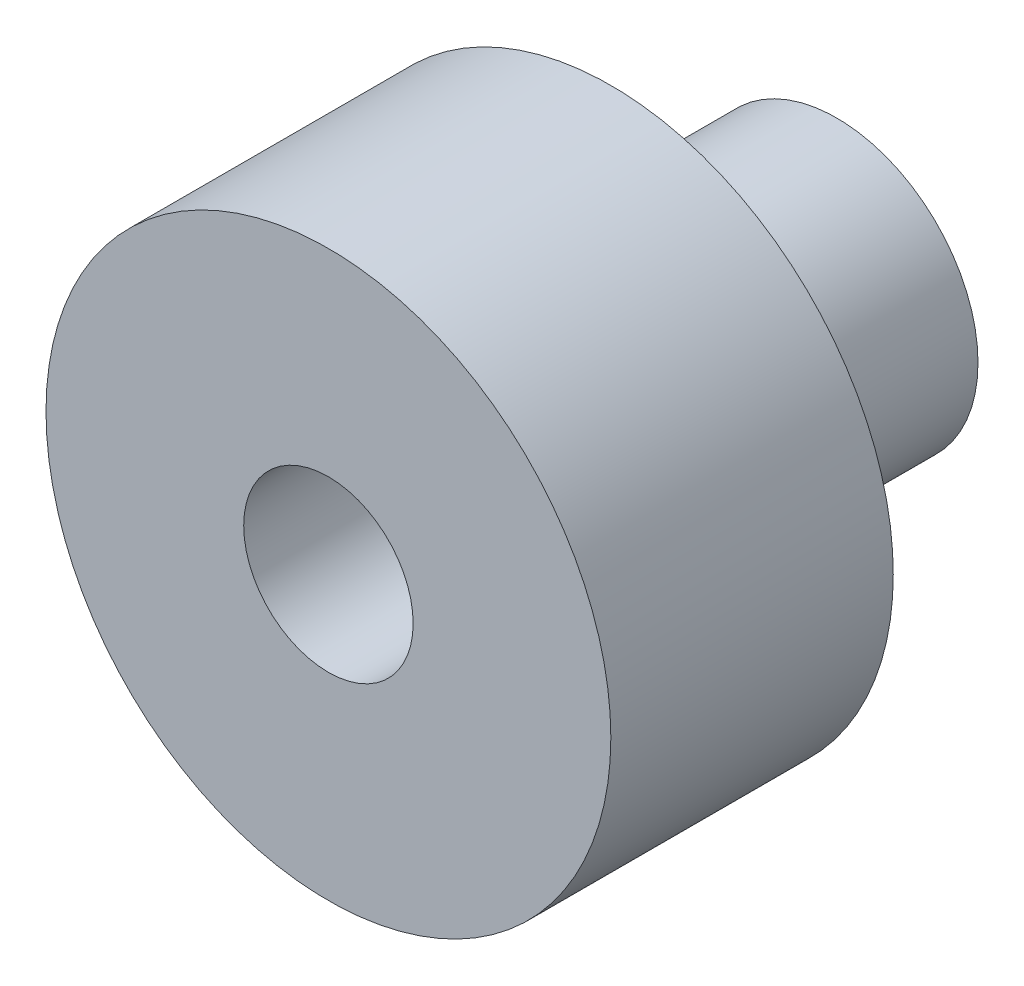
ISO-10303-21;
HEADER;
FILE_DESCRIPTION(('STEP AP214'),'2;1');
FILE_NAME('part.step','',(''),(''),'','','');
FILE_SCHEMA(('AUTOMOTIVE_DESIGN { 1 0 10303 214 1 1 1 1 }'));
ENDSEC;
DATA;
#1=APPLICATION_CONTEXT('core data for automotive mechanical design processes');
#2=APPLICATION_PROTOCOL_DEFINITION('international standard','automotive_design',2000,#1);
#3=PRODUCT_CONTEXT('',#1,'mechanical');
#4=PRODUCT('Part','Part','',(#3));
#5=PRODUCT_RELATED_PRODUCT_CATEGORY('part','',(#4));
#6=PRODUCT_DEFINITION_FORMATION('','',#4);
#7=PRODUCT_DEFINITION_CONTEXT('part definition',#1,'design');
#8=PRODUCT_DEFINITION('design','',#6,#7);
#9=PRODUCT_DEFINITION_SHAPE('','',#8);
#10=(LENGTH_UNIT() NAMED_UNIT(*) SI_UNIT(.MILLI.,.METRE.));
#11=(NAMED_UNIT(*) PLANE_ANGLE_UNIT() SI_UNIT($,.RADIAN.));
#12=(NAMED_UNIT(*) SI_UNIT($,.STERADIAN.) SOLID_ANGLE_UNIT());
#13=UNCERTAINTY_MEASURE_WITH_UNIT(LENGTH_MEASURE(1.E-05),#10,'distance_accuracy_value','');
#14=(GEOMETRIC_REPRESENTATION_CONTEXT(3) GLOBAL_UNCERTAINTY_ASSIGNED_CONTEXT((#13)) GLOBAL_UNIT_ASSIGNED_CONTEXT((#10,
#11,#12)) REPRESENTATION_CONTEXT('',''));
#15=CARTESIAN_POINT('',(0.,0.,0.));
#16=DIRECTION('',(0.,0.,1.));
#17=DIRECTION('',(1.,0.,0.));
#18=AXIS2_PLACEMENT_3D('',#15,#16,#17);
#19=CARTESIAN_POINT('',(0.,0.,10.));
#20=DIRECTION('',(0.,0.,-1.));
#21=DIRECTION('',(-1.,0.,0.));
#22=AXIS2_PLACEMENT_3D('',#19,#20,#21);
#23=CYLINDRICAL_SURFACE('',#22,10.);
#24=CARTESIAN_POINT('',(0.,0.,10.));
#25=DIRECTION('',(0.,0.,1.));
#26=DIRECTION('',(1.,0.,0.));
#27=AXIS2_PLACEMENT_3D('',#24,#25,#26);
#28=CIRCLE('',#27,10.);
#29=CARTESIAN_POINT('',(10.,0.,10.));
#30=VERTEX_POINT('',#29);
#31=EDGE_CURVE('E41',#30,#30,#28,.T.);
#32=ORIENTED_EDGE('',*,*,#31,.F.);
#33=EDGE_LOOP('',(#32));
#34=FACE_BOUND('',#33,.T.);
#35=CARTESIAN_POINT('',(0.,0.,0.));
#36=DIRECTION('',(0.,0.,1.));
#37=DIRECTION('',(1.,0.,0.));
#38=AXIS2_PLACEMENT_3D('',#35,#36,#37);
#39=CIRCLE('',#38,10.);
#40=CARTESIAN_POINT('',(10.,0.,0.));
#41=VERTEX_POINT('',#40);
#42=EDGE_CURVE('E45',#41,#41,#39,.T.);
#43=ORIENTED_EDGE('',*,*,#42,.T.);
#44=EDGE_LOOP('',(#43));
#45=FACE_BOUND('',#44,.T.);
#46=ADVANCED_FACE('F30',(#34,#45),#23,.T.);
#47=CARTESIAN_POINT('',(0.,0.,10.));
#48=DIRECTION('',(0.,0.,1.));
#49=DIRECTION('',(1.,0.,0.));
#50=AXIS2_PLACEMENT_3D('',#47,#48,#49);
#51=PLANE('',#50);
#52=CARTESIAN_POINT('',(0.,0.,10.));
#53=DIRECTION('',(0.,0.,1.));
#54=DIRECTION('',(1.,0.,0.));
#55=AXIS2_PLACEMENT_3D('',#52,#53,#54);
#56=CIRCLE('',#55,3.);
#57=CARTESIAN_POINT('',(3.,0.,10.));
#58=VERTEX_POINT('',#57);
#59=EDGE_CURVE('E53',#58,#58,#56,.T.);
#60=ORIENTED_EDGE('',*,*,#59,.F.);
#61=EDGE_LOOP('',(#60));
#62=FACE_BOUND('',#61,.T.);
#63=ORIENTED_EDGE('',*,*,#31,.T.);
#64=EDGE_LOOP('',(#63));
#65=FACE_BOUND('',#64,.T.);
#66=ADVANCED_FACE('F88',(#62,#65),#51,.T.);
#67=CARTESIAN_POINT('',(0.,0.,0.));
#68=DIRECTION('',(0.,0.,1.));
#69=DIRECTION('',(1.,0.,0.));
#70=AXIS2_PLACEMENT_3D('',#67,#68,#69);
#71=PLANE('',#70);
#72=CARTESIAN_POINT('',(0.,0.,0.));
#73=DIRECTION('',(0.,0.,1.));
#74=DIRECTION('',(1.,0.,0.));
#75=AXIS2_PLACEMENT_3D('',#72,#73,#74);
#76=CIRCLE('',#75,5.);
#77=CARTESIAN_POINT('',(5.,0.,0.));
#78=VERTEX_POINT('',#77);
#79=EDGE_CURVE('E10',#78,#78,#76,.F.);
#80=ORIENTED_EDGE('',*,*,#79,.F.);
#81=EDGE_LOOP('',(#80));
#82=FACE_BOUND('',#81,.T.);
#83=ORIENTED_EDGE('',*,*,#42,.F.);
#84=EDGE_LOOP('',(#83));
#85=FACE_BOUND('',#84,.T.);
#86=ADVANCED_FACE('F83',(#82,#85),#71,.F.);
#87=CARTESIAN_POINT('',(0.,0.,-8.));
#88=DIRECTION('',(0.,0.,1.));
#89=DIRECTION('',(1.,0.,0.));
#90=AXIS2_PLACEMENT_3D('',#87,#88,#89);
#91=CYLINDRICAL_SURFACE('',#90,5.);
#92=CARTESIAN_POINT('',(0.,-5.,-3.5));
#93=CARTESIAN_POINT('',(0.0822886127533032,-4.9999992925055,-3.50000099748489));
#94=CARTESIAN_POINT('',(0.164587318351532,-4.99794915693954,-3.50679386362397));
#95=CARTESIAN_POINT('',(0.326788125304885,-4.98997105593691,-3.53372135422211));
#96=CARTESIAN_POINT('',(0.406689504411425,-4.98404193389692,-3.55385995802335));
#97=CARTESIAN_POINT('',(0.561732707754531,-4.96895552501837,-3.60674601691027));
#98=CARTESIAN_POINT('',(0.636881364395376,-4.95980300250425,-3.63947486961894));
#99=CARTESIAN_POINT('',(0.780624181053136,-4.93922109237645,-3.71653609305584));
#100=CARTESIAN_POINT('',(0.849217467469677,-4.92779140192067,-3.76087000739542));
#101=CARTESIAN_POINT('',(0.979871797183751,-4.90350737192774,-3.86122400747267));
#102=CARTESIAN_POINT('',(1.04171807124434,-4.89062383657036,-3.91751662588592));
#103=CARTESIAN_POINT('',(1.15524920923324,-4.86505834210442,-4.03960922991019));
#104=CARTESIAN_POINT('',(1.20693236327441,-4.85237641724502,-4.10541081212496));
#105=CARTESIAN_POINT('',(1.29980037723708,-4.82834113993772,-4.24647075303761));
#106=CARTESIAN_POINT('',(1.34072309022213,-4.81702406663875,-4.32190846099074));
#107=CARTESIAN_POINT('',(1.4092139477476,-4.79743620394031,-4.4789892542303));
#108=CARTESIAN_POINT('',(1.43678529919973,-4.78916468313311,-4.56063084392798));
#109=CARTESIAN_POINT('',(1.47701633682652,-4.77690870838434,-4.72539026613046));
#110=CARTESIAN_POINT('',(1.49007196234677,-4.77281069324533,-4.80840274386395));
#111=CARTESIAN_POINT('',(1.50213730614672,-4.76902789749767,-4.97553315621677));
#112=CARTESIAN_POINT('',(1.50115042761078,-4.76934204760572,-5.05965081805909));
#113=CARTESIAN_POINT('',(1.48546977199812,-4.77424744067778,-5.22338390860849));
#114=CARTESIAN_POINT('',(1.47127205262685,-4.77868388599141,-5.30305225036224));
#115=CARTESIAN_POINT('',(1.43037420427056,-4.79108356228624,-5.45881978627346));
#116=CARTESIAN_POINT('',(1.40367284141641,-4.79904714132351,-5.53491862737434));
#117=CARTESIAN_POINT('',(1.33816026653682,-4.81772733074973,-5.68260034966074));
#118=CARTESIAN_POINT('',(1.29918816934643,-4.82848016115952,-5.75410708395527));
#119=CARTESIAN_POINT('',(1.21035222588683,-4.85150987000065,-5.88973202201019));
#120=CARTESIAN_POINT('',(1.16048574002588,-4.86378711746991,-5.95384842941378));
#121=CARTESIAN_POINT('',(1.04881290765546,-4.88911011297938,-6.07568619076202));
#122=CARTESIAN_POINT('',(0.986594907466973,-4.90216654310498,-6.13302866402967));
#123=CARTESIAN_POINT('',(0.853263259313968,-4.92712244063259,-6.23655398406425));
#124=CARTESIAN_POINT('',(0.782149051860889,-4.93902183518411,-6.28273612841443));
#125=CARTESIAN_POINT('',(0.632355038342804,-4.96043160069471,-6.36285992246474));
#126=CARTESIAN_POINT('',(0.553627749747951,-4.96992543668314,-6.39671751624987));
#127=CARTESIAN_POINT('',(0.39124541560352,-4.98533521832222,-6.45059959009963));
#128=CARTESIAN_POINT('',(0.307591751589582,-4.99125216186999,-6.47062792853249));
#129=CARTESIAN_POINT('',(0.140952242668332,-4.99868364643538,-6.4956521778994));
#130=CARTESIAN_POINT('',(0.0580500976011879,-5.0003485041779,-6.50116158580162));
#131=CARTESIAN_POINT('',(-0.107499605823381,-4.9995292324176,-6.49843084428792));
#132=CARTESIAN_POINT('',(-0.190147196690778,-4.99704565677757,-6.49019253034856));
#133=CARTESIAN_POINT('',(-0.350903605309694,-4.98830696987163,-6.46061538888851));
#134=CARTESIAN_POINT('',(-0.429072772614167,-4.98213829799417,-6.43957661241914));
#135=CARTESIAN_POINT('',(-0.580754638954519,-4.96674347841533,-6.38535676722181));
#136=CARTESIAN_POINT('',(-0.654266777025581,-4.95751696321085,-6.35217423896214));
#137=CARTESIAN_POINT('',(-0.796437189461051,-4.93669654351325,-6.27374683451888));
#138=CARTESIAN_POINT('',(-0.864943826199669,-4.92505280829675,-6.22824065905203));
#139=CARTESIAN_POINT('',(-0.993523307980147,-4.90073468764317,-6.12677524594719));
#140=CARTESIAN_POINT('',(-1.05359403235593,-4.8880600443108,-6.07081338811233));
#141=CARTESIAN_POINT('',(-1.16585744551027,-4.86253171869138,-5.94761269163066));
#142=CARTESIAN_POINT('',(-1.21768481231504,-4.84968825033268,-5.88003812422827));
#143=CARTESIAN_POINT('',(-1.30928995072154,-4.82576515238463,-5.73687206098647));
#144=CARTESIAN_POINT('',(-1.34906803829472,-4.81468547654651,-5.66128077544179));
#145=CARTESIAN_POINT('',(-1.41517347127168,-4.79567189615055,-5.50446750874532));
#146=CARTESIAN_POINT('',(-1.4415634693705,-4.78772337843827,-5.42327381346341));
#147=CARTESIAN_POINT('',(-1.48021730815114,-4.77591594362794,-5.25731203106853));
#148=CARTESIAN_POINT('',(-1.49248598978779,-4.772055625083,-5.17254517921234));
#149=CARTESIAN_POINT('',(-1.50221984485059,-4.76899972496087,-5.00563848162377));
#150=CARTESIAN_POINT('',(-1.5002805530849,-4.76961647442754,-4.92353634898242));
#151=CARTESIAN_POINT('',(-1.48307505444813,-4.77499401288294,-4.7608858966272));
#152=CARTESIAN_POINT('',(-1.46780938124716,-4.77975463592551,-4.68033751482365));
#153=CARTESIAN_POINT('',(-1.42476888804136,-4.79275763670386,-4.52405460085715));
#154=CARTESIAN_POINT('',(-1.39715175507068,-4.80095604545965,-4.44827271263831));
#155=CARTESIAN_POINT('',(-1.33031507121129,-4.81990278909136,-4.30235756118228));
#156=CARTESIAN_POINT('',(-1.29109329962876,-4.83065161194312,-4.23222538235924));
#157=CARTESIAN_POINT('',(-1.20048763805072,-4.85397676425833,-4.09683688347289));
#158=CARTESIAN_POINT('',(-1.14871276092994,-4.86660540163798,-4.03185123873959));
#159=CARTESIAN_POINT('',(-1.03517434629782,-4.89201320450026,-3.91129750169214));
#160=CARTESIAN_POINT('',(-0.973408217134499,-4.90479240823905,-3.85573186053225));
#161=CARTESIAN_POINT('',(-0.839465762183246,-4.92950936570649,-3.75397658770497));
#162=CARTESIAN_POINT('',(-0.767037885790605,-4.94141159765674,-3.70810855314452));
#163=CARTESIAN_POINT('',(-0.615141373983528,-4.96260680455813,-3.62926483009598));
#164=CARTESIAN_POINT('',(-0.535676052998956,-4.97190099931067,-3.59628311172549));
#165=CARTESIAN_POINT('',(-0.380757712655282,-4.98602174969301,-3.54710472434725));
#166=CARTESIAN_POINT('',(-0.305786961954233,-4.99122027381068,-3.52948832711676));
#167=CARTESIAN_POINT('',(-0.153880195230776,-4.99820944494492,-3.50593647475843));
#168=CARTESIAN_POINT('',(-0.0769445098581361,-5.0000006615474,-3.49999906729518));
#169=CARTESIAN_POINT('',(0.,-5.,-3.5));
#170=B_SPLINE_CURVE_WITH_KNOTS('',3,(#92,#93,#94,#95,#96,#97,#98,#99,#100,#101,#102,#103,#104,
#105,#106,#107,#108,#109,#110,#111,#112,#113,#114,#115,#116,#117,#118,#119,#120,#121,#122,#123,
#124,#125,#126,#127,#128,#129,#130,#131,#132,#133,#134,#135,#136,#137,#138,#139,#140,#141,#142,
#143,#144,#145,#146,#147,#148,#149,#150,#151,#152,#153,#154,#155,#156,#157,#158,#159,#160,#161,
#162,#163,#164,#165,#166,#167,#168,#169),.UNSPECIFIED.,.T.,.F.,(4,2,2,2,2,2,2,2,2,2,2,2,2,2,2,2,
2,2,2,2,2,2,2,2,2,2,2,2,2,2,2,2,2,2,2,2,2,2,4),(0.,0.246583203612611,0.493239964846001,
0.739533676300876,0.985860164412704,1.23855602948191,1.49129437288632,1.74971481004109,
2.00807314543223,2.25919689356599,2.51025978319089,2.75226016697676,2.99428443658001,
3.23962426447119,3.48502360158555,3.74067104048166,3.99633456531071,4.25371046881688,
4.51101453528807,4.75908809438545,5.00712853550326,5.24956746682326,5.49203554593728,
5.74011305702908,5.98825282000191,6.24540400322818,6.5025484425268,6.75847814951251,
7.01432009460283,7.25950155466943,7.504673196616,7.74680040402721,7.98897397553107,
8.23996925679931,8.49102974897502,8.74942996156671,9.00770911595235,9.23831691930459,
9.46888616948874),.UNSPECIFIED.);
#171=CARTESIAN_POINT('',(0.,-5.,-3.5));
#172=VERTEX_POINT('',#171);
#173=EDGE_CURVE('E59',#172,#172,#170,.T.);
#174=ORIENTED_EDGE('',*,*,#173,.T.);
#175=EDGE_LOOP('',(#174));
#176=FACE_BOUND('',#175,.T.);
#177=CARTESIAN_POINT('',(0.,0.,-8.));
#178=DIRECTION('',(0.,0.,-1.));
#179=DIRECTION('',(-1.,0.,0.));
#180=AXIS2_PLACEMENT_3D('',#177,#178,#179);
#181=CIRCLE('',#180,5.);
#182=CARTESIAN_POINT('',(-5.,0.,-8.));
#183=VERTEX_POINT('',#182);
#184=EDGE_CURVE('E49',#183,#183,#181,.T.);
#185=ORIENTED_EDGE('',*,*,#184,.F.);
#186=EDGE_LOOP('',(#185));
#187=FACE_BOUND('',#186,.T.);
#188=ORIENTED_EDGE('',*,*,#79,.T.);
#189=EDGE_LOOP('',(#188));
#190=FACE_BOUND('',#189,.T.);
#191=ADVANCED_FACE('F64',(#176,#187,#190),#91,.T.);
#192=CARTESIAN_POINT('',(0.,0.,-8.));
#193=DIRECTION('',(0.,0.,-1.));
#194=DIRECTION('',(-1.,0.,0.));
#195=AXIS2_PLACEMENT_3D('',#192,#193,#194);
#196=PLANE('',#195);
#197=CARTESIAN_POINT('',(0.,0.,-8.));
#198=DIRECTION('',(0.,0.,-1.));
#199=DIRECTION('',(-1.,0.,0.));
#200=AXIS2_PLACEMENT_3D('',#197,#198,#199);
#201=CIRCLE('',#200,3.);
#202=CARTESIAN_POINT('',(-3.,0.,-8.));
#203=VERTEX_POINT('',#202);
#204=EDGE_CURVE('E56',#203,#203,#201,.T.);
#205=ORIENTED_EDGE('',*,*,#204,.F.);
#206=EDGE_LOOP('',(#205));
#207=FACE_BOUND('',#206,.T.);
#208=ORIENTED_EDGE('',*,*,#184,.T.);
#209=EDGE_LOOP('',(#208));
#210=FACE_BOUND('',#209,.T.);
#211=ADVANCED_FACE('F76',(#207,#210),#196,.T.);
#212=CARTESIAN_POINT('',(0.,0.,19.));
#213=DIRECTION('',(0.,0.,-1.));
#214=DIRECTION('',(-1.,0.,0.));
#215=AXIS2_PLACEMENT_3D('',#212,#213,#214);
#216=CYLINDRICAL_SURFACE('',#215,3.);
#217=CARTESIAN_POINT('',(0.,-3.,-3.5));
#218=CARTESIAN_POINT('',(-0.0788579444268464,-2.99999570107562,-3.50000495347579));
#219=CARTESIAN_POINT('',(-0.15780989954634,-2.99685736529635,-3.50625510968159));
#220=CARTESIAN_POINT('',(-0.31338035290334,-2.98461234055736,-3.53097932051231));
#221=CARTESIAN_POINT('',(-0.38999413007044,-2.9754943174338,-3.54947658949673));
#222=CARTESIAN_POINT('',(-0.53840031732067,-2.95224419105063,-3.59779071292495));
#223=CARTESIAN_POINT('',(-0.610210204408716,-2.93813158766307,-3.62756357637196));
#224=CARTESIAN_POINT('',(-0.747708925209895,-2.90618664773643,-3.69735593204748));
#225=CARTESIAN_POINT('',(-0.813398240985086,-2.88835460450288,-3.7373746163733));
#226=CARTESIAN_POINT('',(-0.941261726642862,-2.84934387387093,-3.82927587422793));
#227=CARTESIAN_POINT('',(-1.00298281668316,-2.82802798691306,-3.88172971885946));
#228=CARTESIAN_POINT('',(-1.11716916730047,-2.78489955370115,-3.99578221887056));
#229=CARTESIAN_POINT('',(-1.16962737466015,-2.76308664313552,-4.05738777765867));
#230=CARTESIAN_POINT('',(-1.26787800067541,-2.71948426796022,-4.19372502428508));
#231=CARTESIAN_POINT('',(-1.31283800332745,-2.69782780455198,-4.26910414751887));
#232=CARTESIAN_POINT('',(-1.38925234033604,-2.65928968158481,-4.42755100397932));
#233=CARTESIAN_POINT('',(-1.4207163224495,-2.64240461410485,-4.51061319308412));
#234=CARTESIAN_POINT('',(-1.46719866328288,-2.61686800556713,-4.67699765813288));
#235=CARTESIAN_POINT('',(-1.48308878562066,-2.60778407375571,-4.76000667810109));
#236=CARTESIAN_POINT('',(-1.50064048996327,-2.59772834922792,-4.92796825666922));
#237=CARTESIAN_POINT('',(-1.50231613255961,-2.59674854014933,-5.01291881130674));
#238=CARTESIAN_POINT('',(-1.49203093075844,-2.60266395385873,-5.17142903647306));
#239=CARTESIAN_POINT('',(-1.48167683930523,-2.60863145493021,-5.24513604683458));
#240=CARTESIAN_POINT('',(-1.4504097735854,-2.62614343100776,-5.38958286405957));
#241=CARTESIAN_POINT('',(-1.42949343584647,-2.63768968247664,-5.46032171795798));
#242=CARTESIAN_POINT('',(-1.377314670579,-2.66531214619111,-5.59884369884849));
#243=CARTESIAN_POINT('',(-1.34582260067399,-2.68148760995998,-5.66651959817869));
#244=CARTESIAN_POINT('',(-1.273562531502,-2.71655106422106,-5.79595143888502));
#245=CARTESIAN_POINT('',(-1.2327903657187,-2.73544027170286,-5.85770470340013));
#246=CARTESIAN_POINT('',(-1.13709908236918,-2.77669736854929,-5.98178187911484));
#247=CARTESIAN_POINT('',(-1.08104168755392,-2.79920265355119,-6.04318531036424));
#248=CARTESIAN_POINT('',(-0.959333368112059,-2.84321434950611,-6.15610312788636));
#249=CARTESIAN_POINT('',(-0.893677884861425,-2.86472027938202,-6.20761278805083));
#250=CARTESIAN_POINT('',(-0.750774758747768,-2.90552980924446,-6.3015284915446));
#251=CARTESIAN_POINT('',(-0.67313038739911,-2.92468476243011,-6.34340070866862));
#252=CARTESIAN_POINT('',(-0.510699323233194,-2.95736821681864,-6.41314554356452));
#253=CARTESIAN_POINT('',(-0.425918364397913,-2.9709011841533,-6.44102927752275));
#254=CARTESIAN_POINT('',(-0.259149737491052,-2.98986500612154,-6.47971310557502));
#255=CARTESIAN_POINT('',(-0.177512295822488,-2.99587407451965,-6.49173685362018));
#256=CARTESIAN_POINT('',(-0.0131693999240242,-3.00109520188656,-6.50219709670174));
#257=CARTESIAN_POINT('',(0.0695355298048672,-3.00031048081979,-6.50064002845921));
#258=CARTESIAN_POINT('',(0.226849457978985,-2.99236788380153,-6.48468996737189));
#259=CARTESIAN_POINT('',(0.3015891120749,-2.98570868532253,-6.47130120090501));
#260=CARTESIAN_POINT('',(0.447610338452916,-2.96733256972261,-6.43364289215732));
#261=CARTESIAN_POINT('',(0.518891528536634,-2.95561509501618,-6.40937215031976));
#262=CARTESIAN_POINT('',(0.658332912674362,-2.92776377120382,-6.35000230035045));
#263=CARTESIAN_POINT('',(0.726345595508708,-2.91151322654446,-6.31461342482557));
#264=CARTESIAN_POINT('',(0.855692042548909,-2.87615961476127,-6.23433869653015));
#265=CARTESIAN_POINT('',(0.917022944664888,-2.85705533350408,-6.18944879810691));
#266=CARTESIAN_POINT('',(1.03765153393382,-2.81562332004297,-6.08635936200393));
#267=CARTESIAN_POINT('',(1.09615811672854,-2.79316327265249,-6.02728569733228));
#268=CARTESIAN_POINT('',(1.20278448167829,-2.7489358741323,-5.90011227308341));
#269=CARTESIAN_POINT('',(1.25089707856781,-2.72716901100071,-5.83200632172813));
#270=CARTESIAN_POINT('',(1.33756187171853,-2.68576788309734,-5.68453451874054));
#271=CARTESIAN_POINT('',(1.37553824370037,-2.66628794383591,-5.60478310085828));
#272=CARTESIAN_POINT('',(1.43712423890206,-2.63361108441202,-5.43873489863755));
#273=CARTESIAN_POINT('',(1.46075237380053,-2.62040607332625,-5.35244671029966));
#274=CARTESIAN_POINT('',(1.49079253120031,-2.60342251538703,-5.18463466567294));
#275=CARTESIAN_POINT('',(1.49863949460818,-2.59886075197598,-5.10344861984714));
#276=CARTESIAN_POINT('',(1.5010337315643,-2.59748031962405,-4.94082939925321));
#277=CARTESIAN_POINT('',(1.49558676993486,-2.60065829439585,-4.85939634689321));
#278=CARTESIAN_POINT('',(1.47288918838997,-2.61356793076615,-4.70677474769985));
#279=CARTESIAN_POINT('',(1.45681247151455,-2.62264641723988,-4.63534929478289));
#280=CARTESIAN_POINT('',(1.41476303733662,-2.64556524281479,-4.49628782086345));
#281=CARTESIAN_POINT('',(1.38878713673989,-2.65940711354503,-4.42865302686196));
#282=CARTESIAN_POINT('',(1.32572361795085,-2.69142795546804,-4.2940627235202));
#283=CARTESIAN_POINT('',(1.28800670672355,-2.70983583593881,-4.22745814725646));
#284=CARTESIAN_POINT('',(1.20322645745609,-2.74852997452291,-4.10108819572812));
#285=CARTESIAN_POINT('',(1.15615825686234,-2.76881720693416,-4.04132640421834));
#286=CARTESIAN_POINT('',(1.04730498999206,-2.81193484737138,-3.92278702646799));
#287=CARTESIAN_POINT('',(0.984426634495892,-2.83477474959943,-3.86501134647457));
#288=CARTESIAN_POINT('',(0.849232209349796,-2.87816628389896,-3.7606055248471));
#289=CARTESIAN_POINT('',(0.776911084957797,-2.89871667939293,-3.71398139079514));
#290=CARTESIAN_POINT('',(0.62389739517442,-2.93547014349806,-3.6331454559319));
#291=CARTESIAN_POINT('',(0.543149255665097,-2.951641447409,-3.5990237461453));
#292=CARTESIAN_POINT('',(0.37611315170713,-2.9775201194848,-3.54528774836389));
#293=CARTESIAN_POINT('',(0.28984169938365,-2.98724585044601,-3.52563222979143));
#294=CARTESIAN_POINT('',(0.168902919736343,-2.99543192870217,-3.50915388337139));
#295=CARTESIAN_POINT('',(0.135242819162349,-2.99714048010377,-3.50572603870049));
#296=CARTESIAN_POINT('',(0.0677275977076401,-2.99942545465224,-3.50114800172888));
#297=CARTESIAN_POINT('',(0.0338724714699458,-3.00000184655072,-3.49999787229469));
#298=CARTESIAN_POINT('',(0.,-3.,-3.5));
#299=B_SPLINE_CURVE_WITH_KNOTS('',3,(#217,#218,#219,#220,#221,#222,#223,#224,#225,#226,#227,
#228,#229,#230,#231,#232,#233,#234,#235,#236,#237,#238,#239,#240,#241,#242,#243,#244,#245,#246,
#247,#248,#249,#250,#251,#252,#253,#254,#255,#256,#257,#258,#259,#260,#261,#262,#263,#264,#265,
#266,#267,#268,#269,#270,#271,#272,#273,#274,#275,#276,#277,#278,#279,#280,#281,#282,#283,#284,
#285,#286,#287,#288,#289,#290,#291,#292,#293,#294,#295,#296,#297,#298),.UNSPECIFIED.,.T.,.F.,(4,
2,2,2,2,2,2,2,2,2,2,2,2,2,2,2,2,2,2,2,2,2,2,2,2,2,2,2,2,2,2,2,2,2,2,2,2,2,2,2,4),(0.,
0.236436386130438,0.473322224563796,0.709293233238448,0.945245640872352,1.19547263807713,
1.44588935648105,1.71572589646129,1.98536921847421,2.23887018210344,2.49212035993531,
2.71508568613981,2.93812205888518,3.16635360252731,3.39468781890333,3.65197412000818,
3.9093830189803,4.17874533321661,4.44789325368419,4.69474935707019,4.94148846767215,
5.16910359759183,5.39674382446398,5.63089284041848,5.86514176122509,6.12239415966628,
6.37982382923148,6.64972023242589,6.91926767918177,7.1629396125457,7.40650589797018,
7.62686895373284,7.84730293182527,8.08254685170431,8.31791341715446,8.58187864135757,
8.84598575071869,9.1119602049529,9.37717362931724,9.47872920200875,9.58028757766599),.UNSPECIFIED.);
#300=CARTESIAN_POINT('',(0.,-3.,-3.5));
#301=VERTEX_POINT('',#300);
#302=EDGE_CURVE('E33',#301,#301,#299,.T.);
#303=ORIENTED_EDGE('',*,*,#302,.T.);
#304=EDGE_LOOP('',(#303));
#305=FACE_BOUND('',#304,.T.);
#306=ORIENTED_EDGE('',*,*,#59,.T.);
#307=EDGE_LOOP('',(#306));
#308=FACE_BOUND('',#307,.T.);
#309=ORIENTED_EDGE('',*,*,#204,.T.);
#310=EDGE_LOOP('',(#309));
#311=FACE_BOUND('',#310,.T.);
#312=ADVANCED_FACE('F71',(#305,#308,#311),#216,.F.);
#313=CARTESIAN_POINT('',(0.,-27.,-5.));
#314=DIRECTION('',(0.,1.,0.));
#315=DIRECTION('',(0.,0.,1.));
#316=AXIS2_PLACEMENT_3D('',#313,#314,#315);
#317=CYLINDRICAL_SURFACE('',#316,1.5);
#318=ORIENTED_EDGE('',*,*,#302,.F.);
#319=EDGE_LOOP('',(#318));
#320=FACE_BOUND('',#319,.T.);
#321=ORIENTED_EDGE('',*,*,#173,.F.);
#322=EDGE_LOOP('',(#321));
#323=FACE_BOUND('',#322,.T.);
#324=ADVANCED_FACE('F68',(#320,#323),#317,.F.);
#325=CLOSED_SHELL('',(#46,#66,#86,#191,#211,#312,#324));
#326=MANIFOLD_SOLID_BREP('B2',#325);
#327=ADVANCED_BREP_SHAPE_REPRESENTATION('',(#18,#326),#14);
#328=SHAPE_DEFINITION_REPRESENTATION(#9,#327);
ENDSEC;
END-ISO-10303-21;
